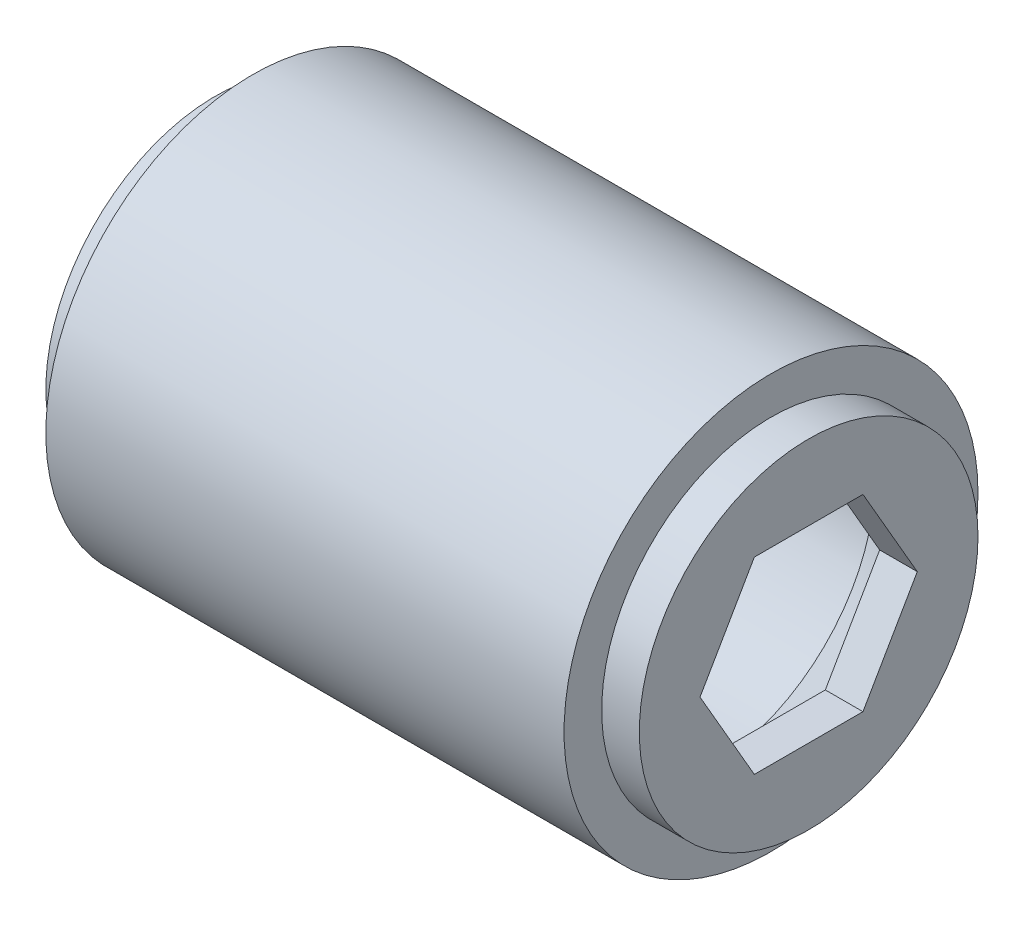
ISO-10303-21;
HEADER;
FILE_DESCRIPTION(('STEP AP214'),'2;1');
FILE_NAME('part.step','',(''),(''),'','','');
FILE_SCHEMA(('AUTOMOTIVE_DESIGN { 1 0 10303 214 1 1 1 1 }'));
ENDSEC;
DATA;
#1=APPLICATION_CONTEXT('core data for automotive mechanical design processes');
#2=APPLICATION_PROTOCOL_DEFINITION('international standard','automotive_design',2000,#1);
#3=PRODUCT_CONTEXT('',#1,'mechanical');
#4=PRODUCT('Part','Part','',(#3));
#5=PRODUCT_RELATED_PRODUCT_CATEGORY('part','',(#4));
#6=PRODUCT_DEFINITION_FORMATION('','',#4);
#7=PRODUCT_DEFINITION_CONTEXT('part definition',#1,'design');
#8=PRODUCT_DEFINITION('design','',#6,#7);
#9=PRODUCT_DEFINITION_SHAPE('','',#8);
#10=(LENGTH_UNIT() NAMED_UNIT(*) SI_UNIT(.MILLI.,.METRE.));
#11=(NAMED_UNIT(*) PLANE_ANGLE_UNIT() SI_UNIT($,.RADIAN.));
#12=(NAMED_UNIT(*) SI_UNIT($,.STERADIAN.) SOLID_ANGLE_UNIT());
#13=UNCERTAINTY_MEASURE_WITH_UNIT(LENGTH_MEASURE(1.E-05),#10,'distance_accuracy_value','');
#14=(GEOMETRIC_REPRESENTATION_CONTEXT(3) GLOBAL_UNCERTAINTY_ASSIGNED_CONTEXT((#13)) GLOBAL_UNIT_ASSIGNED_CONTEXT((#10,
#11,#12)) REPRESENTATION_CONTEXT('',''));
#15=CARTESIAN_POINT('',(0.,0.,0.));
#16=DIRECTION('',(0.,0.,1.));
#17=DIRECTION('',(1.,0.,0.));
#18=AXIS2_PLACEMENT_3D('',#15,#16,#17);
#19=CARTESIAN_POINT('',(-31.54,9.,0.));
#20=DIRECTION('',(-1.,0.,0.));
#21=DIRECTION('',(0.,0.,1.));
#22=AXIS2_PLACEMENT_3D('',#19,#20,#21);
#23=PLANE('',#22);
#24=DIRECTION('',(0.,0.,-1.));
#25=VECTOR('',#24,1.);
#26=CARTESIAN_POINT('',(-31.54,5.,2.88675134594813));
#27=LINE('',#26,#25);
#28=CARTESIAN_POINT('',(-31.54,5.,2.88675134594813));
#29=VERTEX_POINT('',#28);
#30=CARTESIAN_POINT('',(-31.54,5.,-2.88675134594813));
#31=VERTEX_POINT('',#30);
#32=EDGE_CURVE('E49',#29,#31,#27,.T.);
#33=ORIENTED_EDGE('',*,*,#32,.F.);
#34=DIRECTION('',(0.,0.866025403784439,-0.5));
#35=VECTOR('',#34,1.);
#36=CARTESIAN_POINT('',(-31.54,0.,5.77350269189626));
#37=LINE('',#36,#35);
#38=CARTESIAN_POINT('',(-31.54,0.,5.77350269189626));
#39=VERTEX_POINT('',#38);
#40=EDGE_CURVE('E149',#39,#29,#37,.T.);
#41=ORIENTED_EDGE('',*,*,#40,.F.);
#42=DIRECTION('',(0.,0.866025403784439,0.5));
#43=VECTOR('',#42,1.);
#44=CARTESIAN_POINT('',(-31.54,-5.,2.88675134594813));
#45=LINE('',#44,#43);
#46=CARTESIAN_POINT('',(-31.54,-5.,2.88675134594813));
#47=VERTEX_POINT('',#46);
#48=EDGE_CURVE('E152',#47,#39,#45,.T.);
#49=ORIENTED_EDGE('',*,*,#48,.F.);
#50=DIRECTION('',(0.,0.,1.));
#51=VECTOR('',#50,1.);
#52=CARTESIAN_POINT('',(-31.54,-5.,-2.88675134594813));
#53=LINE('',#52,#51);
#54=CARTESIAN_POINT('',(-31.54,-5.,-2.88675134594813));
#55=VERTEX_POINT('',#54);
#56=EDGE_CURVE('E169',#55,#47,#53,.T.);
#57=ORIENTED_EDGE('',*,*,#56,.F.);
#58=DIRECTION('',(0.,-0.866025403784439,0.5));
#59=VECTOR('',#58,1.);
#60=CARTESIAN_POINT('',(-31.54,0.,-5.77350269189626));
#61=LINE('',#60,#59);
#62=CARTESIAN_POINT('',(-31.54,0.,-5.77350269189626));
#63=VERTEX_POINT('',#62);
#64=EDGE_CURVE('E166',#63,#55,#61,.T.);
#65=ORIENTED_EDGE('',*,*,#64,.F.);
#66=DIRECTION('',(0.,-0.866025403784439,-0.5));
#67=VECTOR('',#66,1.);
#68=CARTESIAN_POINT('',(-31.54,5.,-2.88675134594813));
#69=LINE('',#68,#67);
#70=EDGE_CURVE('E163',#31,#63,#69,.T.);
#71=ORIENTED_EDGE('',*,*,#70,.F.);
#72=EDGE_LOOP('',(#33,#41,#49,#57,#65,#71));
#73=FACE_BOUND('',#72,.T.);
#74=CARTESIAN_POINT('',(-31.54,0.,0.));
#75=DIRECTION('',(1.,0.,0.));
#76=DIRECTION('',(0.,0.,-1.));
#77=AXIS2_PLACEMENT_3D('',#74,#75,#76);
#78=CIRCLE('',#77,9.);
#79=CARTESIAN_POINT('',(-31.54,0.,-9.));
#80=VERTEX_POINT('',#79);
#81=EDGE_CURVE('E216',#80,#80,#78,.T.);
#82=ORIENTED_EDGE('',*,*,#81,.F.);
#83=EDGE_LOOP('',(#82));
#84=FACE_BOUND('',#83,.T.);
#85=ADVANCED_FACE('F34',(#73,#84),#23,.T.);
#86=CARTESIAN_POINT('',(0.,0.,0.));
#87=DIRECTION('',(1.,0.,0.));
#88=DIRECTION('',(0.,0.,-1.));
#89=AXIS2_PLACEMENT_3D('',#86,#87,#88);
#90=CYLINDRICAL_SURFACE('',#89,9.);
#91=ORIENTED_EDGE('',*,*,#81,.T.);
#92=EDGE_LOOP('',(#91));
#93=FACE_BOUND('',#92,.T.);
#94=CARTESIAN_POINT('',(-29.54,0.,0.));
#95=DIRECTION('',(1.,0.,0.));
#96=DIRECTION('',(0.,0.,-1.));
#97=AXIS2_PLACEMENT_3D('',#94,#95,#96);
#98=CIRCLE('',#97,9.);
#99=CARTESIAN_POINT('',(-29.54,0.,-9.));
#100=VERTEX_POINT('',#99);
#101=EDGE_CURVE('E213',#100,#100,#98,.T.);
#102=ORIENTED_EDGE('',*,*,#101,.F.);
#103=EDGE_LOOP('',(#102));
#104=FACE_BOUND('',#103,.T.);
#105=ADVANCED_FACE('F281',(#93,#104),#90,.T.);
#106=CARTESIAN_POINT('',(-29.54,9.,0.));
#107=DIRECTION('',(-1.,0.,0.));
#108=DIRECTION('',(0.,0.,1.));
#109=AXIS2_PLACEMENT_3D('',#106,#107,#108);
#110=PLANE('',#109);
#111=ORIENTED_EDGE('',*,*,#101,.T.);
#112=EDGE_LOOP('',(#111));
#113=FACE_BOUND('',#112,.T.);
#114=CARTESIAN_POINT('',(-29.54,0.,0.));
#115=DIRECTION('',(1.,0.,0.));
#116=DIRECTION('',(0.,0.,-1.));
#117=AXIS2_PLACEMENT_3D('',#114,#115,#116);
#118=CIRCLE('',#117,11.);
#119=CARTESIAN_POINT('',(-29.54,0.,-11.));
#120=VERTEX_POINT('',#119);
#121=EDGE_CURVE('E210',#120,#120,#118,.T.);
#122=ORIENTED_EDGE('',*,*,#121,.F.);
#123=EDGE_LOOP('',(#122));
#124=FACE_BOUND('',#123,.T.);
#125=ADVANCED_FACE('F286',(#113,#124),#110,.T.);
#126=CARTESIAN_POINT('',(0.,0.,0.));
#127=DIRECTION('',(1.,0.,0.));
#128=DIRECTION('',(0.,0.,-1.));
#129=AXIS2_PLACEMENT_3D('',#126,#127,#128);
#130=CYLINDRICAL_SURFACE('',#129,11.);
#131=ORIENTED_EDGE('',*,*,#121,.T.);
#132=EDGE_LOOP('',(#131));
#133=FACE_BOUND('',#132,.T.);
#134=CARTESIAN_POINT('',(-2.,0.,0.));
#135=DIRECTION('',(1.,0.,0.));
#136=DIRECTION('',(0.,0.,-1.));
#137=AXIS2_PLACEMENT_3D('',#134,#135,#136);
#138=CIRCLE('',#137,11.);
#139=CARTESIAN_POINT('',(-2.,0.,-11.));
#140=VERTEX_POINT('',#139);
#141=EDGE_CURVE('E207',#140,#140,#138,.T.);
#142=ORIENTED_EDGE('',*,*,#141,.F.);
#143=EDGE_LOOP('',(#142));
#144=FACE_BOUND('',#143,.T.);
#145=ADVANCED_FACE('F354',(#133,#144),#130,.T.);
#146=CARTESIAN_POINT('',(-2.,9.,0.));
#147=DIRECTION('',(1.,0.,0.));
#148=DIRECTION('',(0.,0.,-1.));
#149=AXIS2_PLACEMENT_3D('',#146,#147,#148);
#150=PLANE('',#149);
#151=ORIENTED_EDGE('',*,*,#141,.T.);
#152=EDGE_LOOP('',(#151));
#153=FACE_BOUND('',#152,.T.);
#154=CARTESIAN_POINT('',(-2.,0.,0.));
#155=DIRECTION('',(1.,0.,0.));
#156=DIRECTION('',(0.,0.,-1.));
#157=AXIS2_PLACEMENT_3D('',#154,#155,#156);
#158=CIRCLE('',#157,9.);
#159=CARTESIAN_POINT('',(-2.,0.,-9.));
#160=VERTEX_POINT('',#159);
#161=EDGE_CURVE('E204',#160,#160,#158,.T.);
#162=ORIENTED_EDGE('',*,*,#161,.F.);
#163=EDGE_LOOP('',(#162));
#164=FACE_BOUND('',#163,.T.);
#165=ADVANCED_FACE('F348',(#153,#164),#150,.T.);
#166=CARTESIAN_POINT('',(0.,0.,0.));
#167=DIRECTION('',(1.,0.,0.));
#168=DIRECTION('',(0.,0.,-1.));
#169=AXIS2_PLACEMENT_3D('',#166,#167,#168);
#170=CYLINDRICAL_SURFACE('',#169,8.99999999999999);
#171=ORIENTED_EDGE('',*,*,#161,.T.);
#172=EDGE_LOOP('',(#171));
#173=FACE_BOUND('',#172,.T.);
#174=CARTESIAN_POINT('',(0.,0.,0.));
#175=DIRECTION('',(1.,0.,0.));
#176=DIRECTION('',(0.,0.,-1.));
#177=AXIS2_PLACEMENT_3D('',#174,#175,#176);
#178=CIRCLE('',#177,8.99999999999999);
#179=CARTESIAN_POINT('',(0.,0.,-8.99999999999999));
#180=VERTEX_POINT('',#179);
#181=EDGE_CURVE('E201',#180,#180,#178,.T.);
#182=ORIENTED_EDGE('',*,*,#181,.F.);
#183=EDGE_LOOP('',(#182));
#184=FACE_BOUND('',#183,.T.);
#185=ADVANCED_FACE('F344',(#173,#184),#170,.T.);
#186=CARTESIAN_POINT('',(0.,6.99999999999999,0.));
#187=DIRECTION('',(1.,0.,0.));
#188=DIRECTION('',(0.,0.,-1.));
#189=AXIS2_PLACEMENT_3D('',#186,#187,#188);
#190=PLANE('',#189);
#191=DIRECTION('',(0.,0.,-1.));
#192=VECTOR('',#191,1.);
#193=CARTESIAN_POINT('',(0.,5.,2.88675134594813));
#194=LINE('',#193,#192);
#195=CARTESIAN_POINT('',(0.,5.,2.88675134594813));
#196=VERTEX_POINT('',#195);
#197=CARTESIAN_POINT('',(0.,5.,-2.88675134594813));
#198=VERTEX_POINT('',#197);
#199=EDGE_CURVE('E129',#196,#198,#194,.T.);
#200=ORIENTED_EDGE('',*,*,#199,.T.);
#201=DIRECTION('',(0.,-0.866025403784439,-0.5));
#202=VECTOR('',#201,1.);
#203=CARTESIAN_POINT('',(0.,5.,-2.88675134594813));
#204=LINE('',#203,#202);
#205=CARTESIAN_POINT('',(0.,0.,-5.77350269189626));
#206=VERTEX_POINT('',#205);
#207=EDGE_CURVE('E139',#198,#206,#204,.T.);
#208=ORIENTED_EDGE('',*,*,#207,.T.);
#209=DIRECTION('',(0.,-0.866025403784439,0.5));
#210=VECTOR('',#209,1.);
#211=CARTESIAN_POINT('',(0.,0.,-5.77350269189626));
#212=LINE('',#211,#210);
#213=CARTESIAN_POINT('',(0.,-5.,-2.88675134594813));
#214=VERTEX_POINT('',#213);
#215=EDGE_CURVE('E57',#206,#214,#212,.T.);
#216=ORIENTED_EDGE('',*,*,#215,.T.);
#217=DIRECTION('',(0.,0.,1.));
#218=VECTOR('',#217,1.);
#219=CARTESIAN_POINT('',(0.,-5.,-2.88675134594813));
#220=LINE('',#219,#218);
#221=CARTESIAN_POINT('',(0.,-5.,2.88675134594813));
#222=VERTEX_POINT('',#221);
#223=EDGE_CURVE('E156',#214,#222,#220,.T.);
#224=ORIENTED_EDGE('',*,*,#223,.T.);
#225=DIRECTION('',(0.,0.866025403784439,0.5));
#226=VECTOR('',#225,1.);
#227=CARTESIAN_POINT('',(0.,-5.,2.88675134594813));
#228=LINE('',#227,#226);
#229=CARTESIAN_POINT('',(0.,0.,5.77350269189626));
#230=VERTEX_POINT('',#229);
#231=EDGE_CURVE('E159',#222,#230,#228,.T.);
#232=ORIENTED_EDGE('',*,*,#231,.T.);
#233=DIRECTION('',(0.,0.866025403784439,-0.5));
#234=VECTOR('',#233,1.);
#235=CARTESIAN_POINT('',(0.,0.,5.77350269189626));
#236=LINE('',#235,#234);
#237=EDGE_CURVE('E148',#230,#196,#236,.T.);
#238=ORIENTED_EDGE('',*,*,#237,.T.);
#239=EDGE_LOOP('',(#200,#208,#216,#224,#232,#238));
#240=FACE_BOUND('',#239,.T.);
#241=ORIENTED_EDGE('',*,*,#181,.T.);
#242=EDGE_LOOP('',(#241));
#243=FACE_BOUND('',#242,.T.);
#244=ADVANCED_FACE('F144',(#240,#243),#190,.T.);
#245=CARTESIAN_POINT('',(0.,5.,-2.88675134594813));
#246=DIRECTION('',(0.,0.5,-0.866025403784438));
#247=DIRECTION('',(0.,0.866025403784439,0.5));
#248=AXIS2_PLACEMENT_3D('',#245,#246,#247);
#249=PLANE('',#248);
#250=DIRECTION('',(0.,0.866025403784439,0.5));
#251=VECTOR('',#250,1.);
#252=CARTESIAN_POINT('',(-29.54,2.5,-4.33012701892219));
#253=LINE('',#252,#251);
#254=CARTESIAN_POINT('',(-29.54,0.,-5.77350269189626));
#255=VERTEX_POINT('',#254);
#256=CARTESIAN_POINT('',(-29.54,5.,-2.88675134594813));
#257=VERTEX_POINT('',#256);
#258=EDGE_CURVE('E231',#255,#257,#253,.T.);
#259=ORIENTED_EDGE('',*,*,#258,.T.);
#260=DIRECTION('',(-1.,0.,0.));
#261=VECTOR('',#260,1.);
#262=CARTESIAN_POINT('',(0.,5.,-2.88675134594813));
#263=LINE('',#262,#261);
#264=EDGE_CURVE('E136',#257,#31,#263,.T.);
#265=ORIENTED_EDGE('',*,*,#264,.T.);
#266=ORIENTED_EDGE('',*,*,#70,.T.);
#267=DIRECTION('',(-1.,0.,0.));
#268=VECTOR('',#267,1.);
#269=CARTESIAN_POINT('',(0.,0.,-5.77350269189626));
#270=LINE('',#269,#268);
#271=EDGE_CURVE('E135',#255,#63,#270,.T.);
#272=ORIENTED_EDGE('',*,*,#271,.F.);
#273=EDGE_LOOP('',(#259,#265,#266,#272));
#274=FACE_BOUND('',#273,.T.);
#275=ADVANCED_FACE('F268',(#274),#249,.F.);
#276=CARTESIAN_POINT('',(0.,0.,-5.77350269189626));
#277=DIRECTION('',(0.,-0.5,-0.866025403784439));
#278=DIRECTION('',(0.,0.866025403784439,-0.5));
#279=AXIS2_PLACEMENT_3D('',#276,#277,#278);
#280=PLANE('',#279);
#281=DIRECTION('',(0.,0.866025403784439,-0.5));
#282=VECTOR('',#281,1.);
#283=CARTESIAN_POINT('',(-29.54,-2.5,-4.33012701892219));
#284=LINE('',#283,#282);
#285=CARTESIAN_POINT('',(-29.54,-5.,-2.88675134594813));
#286=VERTEX_POINT('',#285);
#287=EDGE_CURVE('E233',#286,#255,#284,.T.);
#288=ORIENTED_EDGE('',*,*,#287,.T.);
#289=ORIENTED_EDGE('',*,*,#271,.T.);
#290=ORIENTED_EDGE('',*,*,#64,.T.);
#291=DIRECTION('',(-1.,0.,0.));
#292=VECTOR('',#291,1.);
#293=CARTESIAN_POINT('',(0.,-5.,-2.88675134594813));
#294=LINE('',#293,#292);
#295=EDGE_CURVE('E189',#286,#55,#294,.T.);
#296=ORIENTED_EDGE('',*,*,#295,.F.);
#297=EDGE_LOOP('',(#288,#289,#290,#296));
#298=FACE_BOUND('',#297,.T.);
#299=ADVANCED_FACE('F261',(#298),#280,.F.);
#300=CARTESIAN_POINT('',(0.,-5.,-2.88675134594813));
#301=DIRECTION('',(0.,-1.,0.));
#302=DIRECTION('',(0.,0.,-1.));
#303=AXIS2_PLACEMENT_3D('',#300,#301,#302);
#304=PLANE('',#303);
#305=DIRECTION('',(0.,0.,-1.));
#306=VECTOR('',#305,1.);
#307=CARTESIAN_POINT('',(-29.54,-5.,0.));
#308=LINE('',#307,#306);
#309=CARTESIAN_POINT('',(-29.54,-5.,2.88675134594813));
#310=VERTEX_POINT('',#309);
#311=EDGE_CURVE('E236',#310,#286,#308,.T.);
#312=ORIENTED_EDGE('',*,*,#311,.T.);
#313=ORIENTED_EDGE('',*,*,#295,.T.);
#314=ORIENTED_EDGE('',*,*,#56,.T.);
#315=DIRECTION('',(-1.,0.,0.));
#316=VECTOR('',#315,1.);
#317=CARTESIAN_POINT('',(0.,-5.,2.88675134594813));
#318=LINE('',#317,#316);
#319=EDGE_CURVE('E185',#310,#47,#318,.T.);
#320=ORIENTED_EDGE('',*,*,#319,.F.);
#321=EDGE_LOOP('',(#312,#313,#314,#320));
#322=FACE_BOUND('',#321,.T.);
#323=ADVANCED_FACE('F259',(#322),#304,.F.);
#324=CARTESIAN_POINT('',(0.,-5.,2.88675134594813));
#325=DIRECTION('',(0.,-0.5,0.866025403784439));
#326=DIRECTION('',(0.,-0.866025403784439,-0.5));
#327=AXIS2_PLACEMENT_3D('',#324,#325,#326);
#328=PLANE('',#327);
#329=DIRECTION('',(0.,-0.866025403784439,-0.5));
#330=VECTOR('',#329,1.);
#331=CARTESIAN_POINT('',(-29.54,-2.5,4.33012701892219));
#332=LINE('',#331,#330);
#333=CARTESIAN_POINT('',(-29.54,0.,5.77350269189626));
#334=VERTEX_POINT('',#333);
#335=EDGE_CURVE('E238',#334,#310,#332,.T.);
#336=ORIENTED_EDGE('',*,*,#335,.T.);
#337=ORIENTED_EDGE('',*,*,#319,.T.);
#338=ORIENTED_EDGE('',*,*,#48,.T.);
#339=DIRECTION('',(-1.,0.,0.));
#340=VECTOR('',#339,1.);
#341=CARTESIAN_POINT('',(0.,0.,5.77350269189626));
#342=LINE('',#341,#340);
#343=EDGE_CURVE('E181',#334,#39,#342,.T.);
#344=ORIENTED_EDGE('',*,*,#343,.F.);
#345=EDGE_LOOP('',(#336,#337,#338,#344));
#346=FACE_BOUND('',#345,.T.);
#347=ADVANCED_FACE('F248',(#346),#328,.F.);
#348=CARTESIAN_POINT('',(0.,0.,5.77350269189626));
#349=DIRECTION('',(0.,0.5,0.866025403784439));
#350=DIRECTION('',(0.,-0.866025403784439,0.5));
#351=AXIS2_PLACEMENT_3D('',#348,#349,#350);
#352=PLANE('',#351);
#353=DIRECTION('',(0.,-0.866025403784439,0.5));
#354=VECTOR('',#353,1.);
#355=CARTESIAN_POINT('',(-29.54,2.5,4.3301270189222));
#356=LINE('',#355,#354);
#357=CARTESIAN_POINT('',(-29.54,5.,2.88675134594813));
#358=VERTEX_POINT('',#357);
#359=EDGE_CURVE('E42',#358,#334,#356,.T.);
#360=ORIENTED_EDGE('',*,*,#359,.T.);
#361=ORIENTED_EDGE('',*,*,#343,.T.);
#362=ORIENTED_EDGE('',*,*,#40,.T.);
#363=DIRECTION('',(-1.,0.,0.));
#364=VECTOR('',#363,1.);
#365=CARTESIAN_POINT('',(0.,5.,2.88675134594813));
#366=LINE('',#365,#364);
#367=EDGE_CURVE('E177',#358,#29,#366,.T.);
#368=ORIENTED_EDGE('',*,*,#367,.F.);
#369=EDGE_LOOP('',(#360,#361,#362,#368));
#370=FACE_BOUND('',#369,.T.);
#371=ADVANCED_FACE('F243',(#370),#352,.F.);
#372=CARTESIAN_POINT('',(0.,5.,2.88675134594813));
#373=DIRECTION('',(0.,1.,0.));
#374=DIRECTION('',(0.,0.,1.));
#375=AXIS2_PLACEMENT_3D('',#372,#373,#374);
#376=PLANE('',#375);
#377=DIRECTION('',(0.,0.,1.));
#378=VECTOR('',#377,1.);
#379=CARTESIAN_POINT('',(-29.54,5.,0.));
#380=LINE('',#379,#378);
#381=EDGE_CURVE('E11',#257,#358,#380,.T.);
#382=ORIENTED_EDGE('',*,*,#381,.T.);
#383=ORIENTED_EDGE('',*,*,#367,.T.);
#384=ORIENTED_EDGE('',*,*,#32,.T.);
#385=ORIENTED_EDGE('',*,*,#264,.F.);
#386=EDGE_LOOP('',(#382,#383,#384,#385));
#387=FACE_BOUND('',#386,.T.);
#388=ADVANCED_FACE('F269',(#387),#376,.F.);
#389=DIRECTION('',(0.,0.,-1.));
#390=VECTOR('',#389,1.);
#391=CARTESIAN_POINT('',(-2.,5.,0.));
#392=LINE('',#391,#390);
#393=CARTESIAN_POINT('',(-2.,5.,2.88675134594813));
#394=VERTEX_POINT('',#393);
#395=CARTESIAN_POINT('',(-2.,5.,-2.88675134594813));
#396=VERTEX_POINT('',#395);
#397=EDGE_CURVE('E132',#394,#396,#392,.T.);
#398=ORIENTED_EDGE('',*,*,#397,.T.);
#399=EDGE_CURVE('E124',#198,#396,#263,.T.);
#400=ORIENTED_EDGE('',*,*,#399,.F.);
#401=ORIENTED_EDGE('',*,*,#199,.F.);
#402=EDGE_CURVE('E174',#196,#394,#366,.T.);
#403=ORIENTED_EDGE('',*,*,#402,.T.);
#404=EDGE_LOOP('',(#398,#400,#401,#403));
#405=FACE_BOUND('',#404,.T.);
#406=ADVANCED_FACE('F126',(#405),#376,.F.);
#407=DIRECTION('',(0.,0.866025403784439,-0.5));
#408=VECTOR('',#407,1.);
#409=CARTESIAN_POINT('',(-2.,2.5,4.3301270189222));
#410=LINE('',#409,#408);
#411=CARTESIAN_POINT('',(-2.,0.,5.77350269189626));
#412=VERTEX_POINT('',#411);
#413=EDGE_CURVE('E198',#412,#394,#410,.T.);
#414=ORIENTED_EDGE('',*,*,#413,.T.);
#415=ORIENTED_EDGE('',*,*,#402,.F.);
#416=ORIENTED_EDGE('',*,*,#237,.F.);
#417=EDGE_CURVE('E178',#230,#412,#342,.T.);
#418=ORIENTED_EDGE('',*,*,#417,.T.);
#419=EDGE_LOOP('',(#414,#415,#416,#418));
#420=FACE_BOUND('',#419,.T.);
#421=ADVANCED_FACE('F276',(#420),#352,.F.);
#422=DIRECTION('',(0.,0.866025403784439,0.5));
#423=VECTOR('',#422,1.);
#424=CARTESIAN_POINT('',(-2.,-2.5,4.33012701892219));
#425=LINE('',#424,#423);
#426=CARTESIAN_POINT('',(-2.,-5.,2.88675134594813));
#427=VERTEX_POINT('',#426);
#428=EDGE_CURVE('E196',#427,#412,#425,.T.);
#429=ORIENTED_EDGE('',*,*,#428,.T.);
#430=ORIENTED_EDGE('',*,*,#417,.F.);
#431=ORIENTED_EDGE('',*,*,#231,.F.);
#432=EDGE_CURVE('E182',#222,#427,#318,.T.);
#433=ORIENTED_EDGE('',*,*,#432,.T.);
#434=EDGE_LOOP('',(#429,#430,#431,#433));
#435=FACE_BOUND('',#434,.T.);
#436=ADVANCED_FACE('F327',(#435),#328,.F.);
#437=DIRECTION('',(0.,0.,1.));
#438=VECTOR('',#437,1.);
#439=CARTESIAN_POINT('',(-2.,-5.,0.));
#440=LINE('',#439,#438);
#441=CARTESIAN_POINT('',(-2.,-5.,-2.88675134594813));
#442=VERTEX_POINT('',#441);
#443=EDGE_CURVE('E194',#442,#427,#440,.T.);
#444=ORIENTED_EDGE('',*,*,#443,.T.);
#445=ORIENTED_EDGE('',*,*,#432,.F.);
#446=ORIENTED_EDGE('',*,*,#223,.F.);
#447=EDGE_CURVE('E186',#214,#442,#294,.T.);
#448=ORIENTED_EDGE('',*,*,#447,.T.);
#449=EDGE_LOOP('',(#444,#445,#446,#448));
#450=FACE_BOUND('',#449,.T.);
#451=ADVANCED_FACE('F325',(#450),#304,.F.);
#452=DIRECTION('',(0.,-0.866025403784439,0.5));
#453=VECTOR('',#452,1.);
#454=CARTESIAN_POINT('',(-2.,-2.5,-4.33012701892219));
#455=LINE('',#454,#453);
#456=CARTESIAN_POINT('',(-2.,0.,-5.77350269189626));
#457=VERTEX_POINT('',#456);
#458=EDGE_CURVE('E192',#457,#442,#455,.T.);
#459=ORIENTED_EDGE('',*,*,#458,.T.);
#460=ORIENTED_EDGE('',*,*,#447,.F.);
#461=ORIENTED_EDGE('',*,*,#215,.F.);
#462=EDGE_CURVE('E141',#206,#457,#270,.T.);
#463=ORIENTED_EDGE('',*,*,#462,.T.);
#464=EDGE_LOOP('',(#459,#460,#461,#463));
#465=FACE_BOUND('',#464,.T.);
#466=ADVANCED_FACE('F318',(#465),#280,.F.);
#467=DIRECTION('',(0.,-0.866025403784439,-0.5));
#468=VECTOR('',#467,1.);
#469=CARTESIAN_POINT('',(-2.,2.5,-4.33012701892219));
#470=LINE('',#469,#468);
#471=EDGE_CURVE('E176',#396,#457,#470,.T.);
#472=ORIENTED_EDGE('',*,*,#471,.T.);
#473=ORIENTED_EDGE('',*,*,#462,.F.);
#474=ORIENTED_EDGE('',*,*,#207,.F.);
#475=ORIENTED_EDGE('',*,*,#399,.T.);
#476=EDGE_LOOP('',(#472,#473,#474,#475));
#477=FACE_BOUND('',#476,.T.);
#478=ADVANCED_FACE('F140',(#477),#249,.F.);
#479=CARTESIAN_POINT('',(-2.,0.,0.));
#480=DIRECTION('',(-1.,0.,0.));
#481=DIRECTION('',(0.,0.,1.));
#482=AXIS2_PLACEMENT_3D('',#479,#480,#481);
#483=PLANE('',#482);
#484=ORIENTED_EDGE('',*,*,#397,.F.);
#485=ORIENTED_EDGE('',*,*,#413,.F.);
#486=ORIENTED_EDGE('',*,*,#428,.F.);
#487=ORIENTED_EDGE('',*,*,#443,.F.);
#488=ORIENTED_EDGE('',*,*,#458,.F.);
#489=ORIENTED_EDGE('',*,*,#471,.F.);
#490=EDGE_LOOP('',(#484,#485,#486,#487,#488,#489));
#491=FACE_BOUND('',#490,.T.);
#492=CARTESIAN_POINT('',(-2.,0.,0.));
#493=DIRECTION('',(1.,0.,0.));
#494=DIRECTION('',(0.,0.,-1.));
#495=AXIS2_PLACEMENT_3D('',#492,#493,#494);
#496=CIRCLE('',#495,6.99999999999999);
#497=CARTESIAN_POINT('',(-2.,0.,-6.99999999999999));
#498=VERTEX_POINT('',#497);
#499=EDGE_CURVE('E228',#498,#498,#496,.T.);
#500=ORIENTED_EDGE('',*,*,#499,.F.);
#501=EDGE_LOOP('',(#500));
#502=FACE_BOUND('',#501,.T.);
#503=ADVANCED_FACE('F36',(#491,#502),#483,.T.);
#504=CARTESIAN_POINT('',(-5.46410161513783,0.,0.));
#505=DIRECTION('',(-1.,0.,0.));
#506=DIRECTION('',(0.,0.,1.));
#507=AXIS2_PLACEMENT_3D('',#504,#505,#506);
#508=CONICAL_SURFACE('',#507,9.,0.523598775598292);
#509=ORIENTED_EDGE('',*,*,#499,.T.);
#510=EDGE_LOOP('',(#509));
#511=FACE_BOUND('',#510,.T.);
#512=CARTESIAN_POINT('',(-5.46410161513783,0.,0.));
#513=DIRECTION('',(1.,0.,0.));
#514=DIRECTION('',(0.,0.,-1.));
#515=AXIS2_PLACEMENT_3D('',#512,#513,#514);
#516=CIRCLE('',#515,9.);
#517=CARTESIAN_POINT('',(-5.46410161513783,0.,-9.));
#518=VERTEX_POINT('',#517);
#519=EDGE_CURVE('E225',#518,#518,#516,.T.);
#520=ORIENTED_EDGE('',*,*,#519,.F.);
#521=EDGE_LOOP('',(#520));
#522=FACE_BOUND('',#521,.T.);
#523=ADVANCED_FACE('F299',(#511,#522),#508,.F.);
#524=CARTESIAN_POINT('',(0.,0.,0.));
#525=DIRECTION('',(1.,0.,0.));
#526=DIRECTION('',(0.,0.,-1.));
#527=AXIS2_PLACEMENT_3D('',#524,#525,#526);
#528=CYLINDRICAL_SURFACE('',#527,9.);
#529=ORIENTED_EDGE('',*,*,#519,.T.);
#530=EDGE_LOOP('',(#529));
#531=FACE_BOUND('',#530,.T.);
#532=CARTESIAN_POINT('',(-26.0758983848622,0.,0.));
#533=DIRECTION('',(1.,0.,0.));
#534=DIRECTION('',(0.,0.,-1.));
#535=AXIS2_PLACEMENT_3D('',#532,#533,#534);
#536=CIRCLE('',#535,9.);
#537=CARTESIAN_POINT('',(-26.0758983848622,0.,-9.));
#538=VERTEX_POINT('',#537);
#539=EDGE_CURVE('E222',#538,#538,#536,.T.);
#540=ORIENTED_EDGE('',*,*,#539,.F.);
#541=EDGE_LOOP('',(#540));
#542=FACE_BOUND('',#541,.T.);
#543=ADVANCED_FACE('F296',(#531,#542),#528,.F.);
#544=CARTESIAN_POINT('',(-29.54,0.,0.));
#545=DIRECTION('',(1.,0.,0.));
#546=DIRECTION('',(0.,0.,-1.));
#547=AXIS2_PLACEMENT_3D('',#544,#545,#546);
#548=CONICAL_SURFACE('',#547,7.,0.523598775598293);
#549=ORIENTED_EDGE('',*,*,#539,.T.);
#550=EDGE_LOOP('',(#549));
#551=FACE_BOUND('',#550,.T.);
#552=CARTESIAN_POINT('',(-29.54,0.,0.));
#553=DIRECTION('',(1.,0.,0.));
#554=DIRECTION('',(0.,0.,-1.));
#555=AXIS2_PLACEMENT_3D('',#552,#553,#554);
#556=CIRCLE('',#555,7.);
#557=CARTESIAN_POINT('',(-29.54,0.,-7.));
#558=VERTEX_POINT('',#557);
#559=EDGE_CURVE('E219',#558,#558,#556,.T.);
#560=ORIENTED_EDGE('',*,*,#559,.F.);
#561=EDGE_LOOP('',(#560));
#562=FACE_BOUND('',#561,.T.);
#563=ADVANCED_FACE('F293',(#551,#562),#548,.F.);
#564=CARTESIAN_POINT('',(-29.54,0.,0.));
#565=DIRECTION('',(1.,0.,0.));
#566=DIRECTION('',(0.,0.,-1.));
#567=AXIS2_PLACEMENT_3D('',#564,#565,#566);
#568=PLANE('',#567);
#569=ORIENTED_EDGE('',*,*,#381,.F.);
#570=ORIENTED_EDGE('',*,*,#258,.F.);
#571=ORIENTED_EDGE('',*,*,#287,.F.);
#572=ORIENTED_EDGE('',*,*,#311,.F.);
#573=ORIENTED_EDGE('',*,*,#335,.F.);
#574=ORIENTED_EDGE('',*,*,#359,.F.);
#575=EDGE_LOOP('',(#569,#570,#571,#572,#573,#574));
#576=FACE_BOUND('',#575,.T.);
#577=ORIENTED_EDGE('',*,*,#559,.T.);
#578=EDGE_LOOP('',(#577));
#579=FACE_BOUND('',#578,.T.);
#580=ADVANCED_FACE('F253',(#576,#579),#568,.T.);
#581=CLOSED_SHELL('',(#85,#105,#125,#145,#165,#185,#244,#275,#299,#323,#347,#371,#388,#406,#421,
#436,#451,#466,#478,#503,#523,#543,#563,#580));
#582=MANIFOLD_SOLID_BREP('B2',#581);
#583=ADVANCED_BREP_SHAPE_REPRESENTATION('',(#18,#582),#14);
#584=SHAPE_DEFINITION_REPRESENTATION(#9,#583);
ENDSEC;
END-ISO-10303-21;
